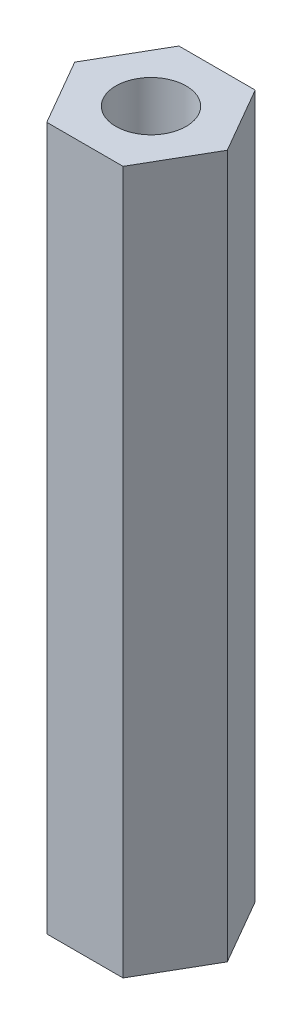
ISO-10303-21;
HEADER;
FILE_DESCRIPTION(('STEP AP214'),'2;1');
FILE_NAME('part.step','',(''),(''),'','','');
FILE_SCHEMA(('AUTOMOTIVE_DESIGN { 1 0 10303 214 1 1 1 1 }'));
ENDSEC;
DATA;
#1=APPLICATION_CONTEXT('core data for automotive mechanical design processes');
#2=APPLICATION_PROTOCOL_DEFINITION('international standard','automotive_design',2000,#1);
#3=PRODUCT_CONTEXT('',#1,'mechanical');
#4=PRODUCT('Part','Part','',(#3));
#5=PRODUCT_RELATED_PRODUCT_CATEGORY('part','',(#4));
#6=PRODUCT_DEFINITION_FORMATION('','',#4);
#7=PRODUCT_DEFINITION_CONTEXT('part definition',#1,'design');
#8=PRODUCT_DEFINITION('design','',#6,#7);
#9=PRODUCT_DEFINITION_SHAPE('','',#8);
#10=(LENGTH_UNIT() NAMED_UNIT(*) SI_UNIT(.MILLI.,.METRE.));
#11=(NAMED_UNIT(*) PLANE_ANGLE_UNIT() SI_UNIT($,.RADIAN.));
#12=(NAMED_UNIT(*) SI_UNIT($,.STERADIAN.) SOLID_ANGLE_UNIT());
#13=UNCERTAINTY_MEASURE_WITH_UNIT(LENGTH_MEASURE(1.E-05),#10,'distance_accuracy_value','');
#14=(GEOMETRIC_REPRESENTATION_CONTEXT(3) GLOBAL_UNCERTAINTY_ASSIGNED_CONTEXT((#13)) GLOBAL_UNIT_ASSIGNED_CONTEXT((#10,
#11,#12)) REPRESENTATION_CONTEXT('',''));
#15=CARTESIAN_POINT('',(0.,0.,0.));
#16=DIRECTION('',(0.,0.,1.));
#17=DIRECTION('',(1.,0.,0.));
#18=AXIS2_PLACEMENT_3D('',#15,#16,#17);
#19=CARTESIAN_POINT('',(0.,25.,0.));
#20=DIRECTION('',(0.,1.,0.));
#21=DIRECTION('',(0.,0.,1.));
#22=AXIS2_PLACEMENT_3D('',#19,#20,#21);
#23=PLANE('',#22);
#24=DIRECTION('',(-0.5,0.,-0.866025403784438));
#25=VECTOR('',#24,1.);
#26=CARTESIAN_POINT('',(2.71354626519124,25.,0.));
#27=LINE('',#26,#25);
#28=CARTESIAN_POINT('',(2.71354626519124,25.,0.));
#29=VERTEX_POINT('',#28);
#30=CARTESIAN_POINT('',(1.35677313259562,25.,-2.35));
#31=VERTEX_POINT('',#30);
#32=EDGE_CURVE('E133',#29,#31,#27,.T.);
#33=ORIENTED_EDGE('',*,*,#32,.T.);
#34=DIRECTION('',(-1.,0.,0.));
#35=VECTOR('',#34,1.);
#36=CARTESIAN_POINT('',(1.35677313259562,25.,-2.35));
#37=LINE('',#36,#35);
#38=CARTESIAN_POINT('',(-1.35677313259562,25.,-2.35));
#39=VERTEX_POINT('',#38);
#40=EDGE_CURVE('E91',#31,#39,#37,.T.);
#41=ORIENTED_EDGE('',*,*,#40,.T.);
#42=DIRECTION('',(-0.5,0.,0.866025403784439));
#43=VECTOR('',#42,1.);
#44=CARTESIAN_POINT('',(-1.35677313259562,25.,-2.35));
#45=LINE('',#44,#43);
#46=CARTESIAN_POINT('',(-2.71354626519124,25.,0.));
#47=VERTEX_POINT('',#46);
#48=EDGE_CURVE('E104',#39,#47,#45,.T.);
#49=ORIENTED_EDGE('',*,*,#48,.T.);
#50=DIRECTION('',(0.5,0.,0.866025403784439));
#51=VECTOR('',#50,1.);
#52=CARTESIAN_POINT('',(-2.71354626519124,25.,0.));
#53=LINE('',#52,#51);
#54=CARTESIAN_POINT('',(-1.35677313259562,25.,2.35));
#55=VERTEX_POINT('',#54);
#56=EDGE_CURVE('E98',#47,#55,#53,.T.);
#57=ORIENTED_EDGE('',*,*,#56,.T.);
#58=DIRECTION('',(1.,0.,0.));
#59=VECTOR('',#58,1.);
#60=CARTESIAN_POINT('',(-1.35677313259562,25.,2.35));
#61=LINE('',#60,#59);
#62=CARTESIAN_POINT('',(1.35677313259562,25.,2.35));
#63=VERTEX_POINT('',#62);
#64=EDGE_CURVE('E102',#55,#63,#61,.T.);
#65=ORIENTED_EDGE('',*,*,#64,.T.);
#66=DIRECTION('',(0.5,0.,-0.866025403784439));
#67=VECTOR('',#66,1.);
#68=CARTESIAN_POINT('',(1.35677313259562,25.,2.35));
#69=LINE('',#68,#67);
#70=EDGE_CURVE('E54',#63,#29,#69,.T.);
#71=ORIENTED_EDGE('',*,*,#70,.T.);
#72=EDGE_LOOP('',(#33,#41,#49,#57,#65,#71));
#73=FACE_BOUND('',#72,.T.);
#74=CARTESIAN_POINT('',(0.,25.,0.));
#75=DIRECTION('',(0.,1.,0.));
#76=DIRECTION('',(0.,0.,1.));
#77=AXIS2_PLACEMENT_3D('',#74,#75,#76);
#78=CIRCLE('',#77,1.25);
#79=CARTESIAN_POINT('',(0.,25.,1.25));
#80=VERTEX_POINT('',#79);
#81=EDGE_CURVE('E126',#80,#80,#78,.T.);
#82=ORIENTED_EDGE('',*,*,#81,.F.);
#83=EDGE_LOOP('',(#82));
#84=FACE_BOUND('',#83,.T.);
#85=ADVANCED_FACE('F37',(#73,#84),#23,.T.);
#86=CARTESIAN_POINT('',(0.,0.,0.));
#87=DIRECTION('',(0.,1.,0.));
#88=DIRECTION('',(0.,0.,1.));
#89=AXIS2_PLACEMENT_3D('',#86,#87,#88);
#90=PLANE('',#89);
#91=DIRECTION('',(-0.5,0.,-0.866025403784438));
#92=VECTOR('',#91,1.);
#93=CARTESIAN_POINT('',(2.71354626519124,0.,0.));
#94=LINE('',#93,#92);
#95=CARTESIAN_POINT('',(2.71354626519124,0.,0.));
#96=VERTEX_POINT('',#95);
#97=CARTESIAN_POINT('',(1.35677313259562,0.,-2.35));
#98=VERTEX_POINT('',#97);
#99=EDGE_CURVE('E122',#96,#98,#94,.T.);
#100=ORIENTED_EDGE('',*,*,#99,.F.);
#101=DIRECTION('',(0.5,0.,-0.866025403784439));
#102=VECTOR('',#101,1.);
#103=CARTESIAN_POINT('',(1.35677313259562,0.,2.35));
#104=LINE('',#103,#102);
#105=CARTESIAN_POINT('',(1.35677313259562,0.,2.35));
#106=VERTEX_POINT('',#105);
#107=EDGE_CURVE('E83',#106,#96,#104,.T.);
#108=ORIENTED_EDGE('',*,*,#107,.F.);
#109=DIRECTION('',(1.,0.,0.));
#110=VECTOR('',#109,1.);
#111=CARTESIAN_POINT('',(-1.35677313259562,0.,2.35));
#112=LINE('',#111,#110);
#113=CARTESIAN_POINT('',(-1.35677313259562,0.,2.35));
#114=VERTEX_POINT('',#113);
#115=EDGE_CURVE('E77',#114,#106,#112,.T.);
#116=ORIENTED_EDGE('',*,*,#115,.F.);
#117=DIRECTION('',(0.5,0.,0.866025403784439));
#118=VECTOR('',#117,1.);
#119=CARTESIAN_POINT('',(-2.71354626519124,0.,0.));
#120=LINE('',#119,#118);
#121=CARTESIAN_POINT('',(-2.71354626519124,0.,0.));
#122=VERTEX_POINT('',#121);
#123=EDGE_CURVE('E112',#122,#114,#120,.T.);
#124=ORIENTED_EDGE('',*,*,#123,.F.);
#125=DIRECTION('',(-0.5,0.,0.866025403784439));
#126=VECTOR('',#125,1.);
#127=CARTESIAN_POINT('',(-1.35677313259562,0.,-2.35));
#128=LINE('',#127,#126);
#129=CARTESIAN_POINT('',(-1.35677313259562,0.,-2.35));
#130=VERTEX_POINT('',#129);
#131=EDGE_CURVE('E128',#130,#122,#128,.T.);
#132=ORIENTED_EDGE('',*,*,#131,.F.);
#133=DIRECTION('',(-1.,0.,0.));
#134=VECTOR('',#133,1.);
#135=CARTESIAN_POINT('',(1.35677313259562,0.,-2.35));
#136=LINE('',#135,#134);
#137=EDGE_CURVE('E125',#98,#130,#136,.T.);
#138=ORIENTED_EDGE('',*,*,#137,.F.);
#139=EDGE_LOOP('',(#100,#108,#116,#124,#132,#138));
#140=FACE_BOUND('',#139,.T.);
#141=CARTESIAN_POINT('',(0.,0.,0.));
#142=DIRECTION('',(0.,1.,0.));
#143=DIRECTION('',(0.,0.,1.));
#144=AXIS2_PLACEMENT_3D('',#141,#142,#143);
#145=CIRCLE('',#144,1.25);
#146=CARTESIAN_POINT('',(0.,0.,1.25));
#147=VERTEX_POINT('',#146);
#148=EDGE_CURVE('E226',#147,#147,#145,.T.);
#149=ORIENTED_EDGE('',*,*,#148,.T.);
#150=EDGE_LOOP('',(#149));
#151=FACE_BOUND('',#150,.T.);
#152=ADVANCED_FACE('F142',(#140,#151),#90,.F.);
#153=CARTESIAN_POINT('',(2.71354626519124,25.,0.));
#154=DIRECTION('',(-0.866025403784438,0.,0.5));
#155=DIRECTION('',(0.5,0.,0.866025403784439));
#156=AXIS2_PLACEMENT_3D('',#153,#154,#155);
#157=PLANE('',#156);
#158=ORIENTED_EDGE('',*,*,#99,.T.);
#159=DIRECTION('',(0.,-1.,0.));
#160=VECTOR('',#159,1.);
#161=CARTESIAN_POINT('',(1.35677313259562,25.,-2.35));
#162=LINE('',#161,#160);
#163=EDGE_CURVE('E11',#31,#98,#162,.T.);
#164=ORIENTED_EDGE('',*,*,#163,.F.);
#165=ORIENTED_EDGE('',*,*,#32,.F.);
#166=DIRECTION('',(0.,-1.,0.));
#167=VECTOR('',#166,1.);
#168=CARTESIAN_POINT('',(2.71354626519124,25.,0.));
#169=LINE('',#168,#167);
#170=EDGE_CURVE('E118',#29,#96,#169,.T.);
#171=ORIENTED_EDGE('',*,*,#170,.T.);
#172=EDGE_LOOP('',(#158,#164,#165,#171));
#173=FACE_BOUND('',#172,.T.);
#174=ADVANCED_FACE('F39',(#173),#157,.F.);
#175=CARTESIAN_POINT('',(1.35677313259562,25.,-2.35));
#176=DIRECTION('',(0.,0.,1.));
#177=DIRECTION('',(1.,0.,0.));
#178=AXIS2_PLACEMENT_3D('',#175,#176,#177);
#179=PLANE('',#178);
#180=ORIENTED_EDGE('',*,*,#137,.T.);
#181=DIRECTION('',(0.,-1.,0.));
#182=VECTOR('',#181,1.);
#183=CARTESIAN_POINT('',(-1.35677313259562,25.,-2.35));
#184=LINE('',#183,#182);
#185=EDGE_CURVE('E46',#39,#130,#184,.T.);
#186=ORIENTED_EDGE('',*,*,#185,.F.);
#187=ORIENTED_EDGE('',*,*,#40,.F.);
#188=ORIENTED_EDGE('',*,*,#163,.T.);
#189=EDGE_LOOP('',(#180,#186,#187,#188));
#190=FACE_BOUND('',#189,.T.);
#191=ADVANCED_FACE('F167',(#190),#179,.F.);
#192=CARTESIAN_POINT('',(-1.35677313259562,25.,-2.35));
#193=DIRECTION('',(0.866025403784439,0.,0.5));
#194=DIRECTION('',(0.5,0.,-0.866025403784439));
#195=AXIS2_PLACEMENT_3D('',#192,#193,#194);
#196=PLANE('',#195);
#197=ORIENTED_EDGE('',*,*,#131,.T.);
#198=DIRECTION('',(0.,-1.,0.));
#199=VECTOR('',#198,1.);
#200=CARTESIAN_POINT('',(-2.71354626519124,25.,0.));
#201=LINE('',#200,#199);
#202=EDGE_CURVE('E113',#47,#122,#201,.T.);
#203=ORIENTED_EDGE('',*,*,#202,.F.);
#204=ORIENTED_EDGE('',*,*,#48,.F.);
#205=ORIENTED_EDGE('',*,*,#185,.T.);
#206=EDGE_LOOP('',(#197,#203,#204,#205));
#207=FACE_BOUND('',#206,.T.);
#208=ADVANCED_FACE('F139',(#207),#196,.F.);
#209=CARTESIAN_POINT('',(-2.71354626519124,25.,0.));
#210=DIRECTION('',(0.866025403784439,0.,-0.5));
#211=DIRECTION('',(-0.5,0.,-0.866025403784439));
#212=AXIS2_PLACEMENT_3D('',#209,#210,#211);
#213=PLANE('',#212);
#214=ORIENTED_EDGE('',*,*,#123,.T.);
#215=DIRECTION('',(0.,-1.,0.));
#216=VECTOR('',#215,1.);
#217=CARTESIAN_POINT('',(-1.35677313259562,25.,2.35));
#218=LINE('',#217,#216);
#219=EDGE_CURVE('E109',#55,#114,#218,.T.);
#220=ORIENTED_EDGE('',*,*,#219,.F.);
#221=ORIENTED_EDGE('',*,*,#56,.F.);
#222=ORIENTED_EDGE('',*,*,#202,.T.);
#223=EDGE_LOOP('',(#214,#220,#221,#222));
#224=FACE_BOUND('',#223,.T.);
#225=ADVANCED_FACE('F110',(#224),#213,.F.);
#226=CARTESIAN_POINT('',(-1.35677313259562,25.,2.35));
#227=DIRECTION('',(0.,0.,-1.));
#228=DIRECTION('',(-1.,0.,0.));
#229=AXIS2_PLACEMENT_3D('',#226,#227,#228);
#230=PLANE('',#229);
#231=ORIENTED_EDGE('',*,*,#115,.T.);
#232=DIRECTION('',(0.,-1.,0.));
#233=VECTOR('',#232,1.);
#234=CARTESIAN_POINT('',(1.35677313259562,25.,2.35));
#235=LINE('',#234,#233);
#236=EDGE_CURVE('E114',#63,#106,#235,.T.);
#237=ORIENTED_EDGE('',*,*,#236,.F.);
#238=ORIENTED_EDGE('',*,*,#64,.F.);
#239=ORIENTED_EDGE('',*,*,#219,.T.);
#240=EDGE_LOOP('',(#231,#237,#238,#239));
#241=FACE_BOUND('',#240,.T.);
#242=ADVANCED_FACE('F116',(#241),#230,.F.);
#243=CARTESIAN_POINT('',(1.35677313259562,25.,2.35));
#244=DIRECTION('',(-0.866025403784439,0.,-0.5));
#245=DIRECTION('',(-0.5,0.,0.866025403784439));
#246=AXIS2_PLACEMENT_3D('',#243,#244,#245);
#247=PLANE('',#246);
#248=ORIENTED_EDGE('',*,*,#107,.T.);
#249=ORIENTED_EDGE('',*,*,#170,.F.);
#250=ORIENTED_EDGE('',*,*,#70,.F.);
#251=ORIENTED_EDGE('',*,*,#236,.T.);
#252=EDGE_LOOP('',(#248,#249,#250,#251));
#253=FACE_BOUND('',#252,.T.);
#254=ADVANCED_FACE('F147',(#253),#247,.F.);
#255=CARTESIAN_POINT('',(0.,25.,0.));
#256=DIRECTION('',(0.,-1.,0.));
#257=DIRECTION('',(0.,0.,-1.));
#258=AXIS2_PLACEMENT_3D('',#255,#256,#257);
#259=CYLINDRICAL_SURFACE('',#258,1.25);
#260=ORIENTED_EDGE('',*,*,#81,.T.);
#261=EDGE_LOOP('',(#260));
#262=FACE_BOUND('',#261,.T.);
#263=ORIENTED_EDGE('',*,*,#148,.F.);
#264=EDGE_LOOP('',(#263));
#265=FACE_BOUND('',#264,.T.);
#266=ADVANCED_FACE('F149',(#262,#265),#259,.F.);
#267=CLOSED_SHELL('',(#85,#152,#174,#191,#208,#225,#242,#254,#266));
#268=MANIFOLD_SOLID_BREP('B2',#267);
#269=ADVANCED_BREP_SHAPE_REPRESENTATION('',(#18,#268),#14);
#270=SHAPE_DEFINITION_REPRESENTATION(#9,#269);
ENDSEC;
END-ISO-10303-21;
